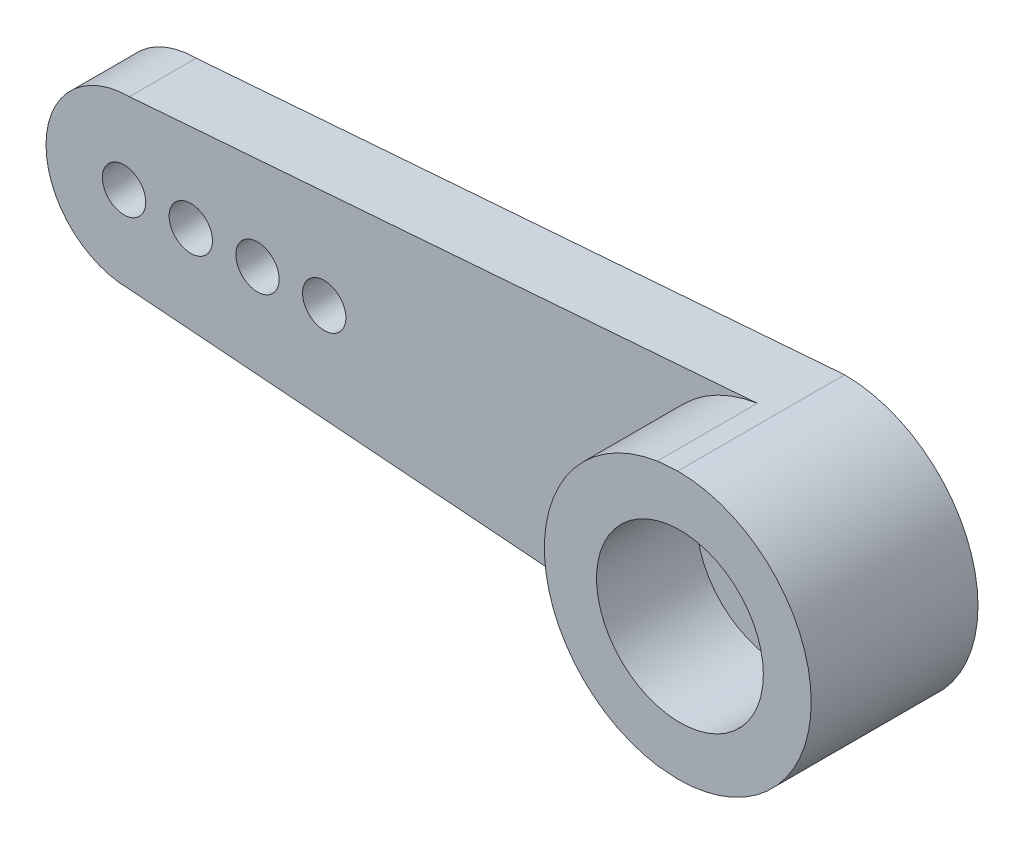
ISO-10303-21;
HEADER;
FILE_DESCRIPTION(('STEP AP214'),'2;1');
FILE_NAME('part.step','',(''),(''),'','','');
FILE_SCHEMA(('AUTOMOTIVE_DESIGN { 1 0 10303 214 1 1 1 1 }'));
ENDSEC;
DATA;
#1=APPLICATION_CONTEXT('core data for automotive mechanical design processes');
#2=APPLICATION_PROTOCOL_DEFINITION('international standard','automotive_design',2000,#1);
#3=PRODUCT_CONTEXT('',#1,'mechanical');
#4=PRODUCT('Part','Part','',(#3));
#5=PRODUCT_RELATED_PRODUCT_CATEGORY('part','',(#4));
#6=PRODUCT_DEFINITION_FORMATION('','',#4);
#7=PRODUCT_DEFINITION_CONTEXT('part definition',#1,'design');
#8=PRODUCT_DEFINITION('design','',#6,#7);
#9=PRODUCT_DEFINITION_SHAPE('','',#8);
#10=(LENGTH_UNIT() NAMED_UNIT(*) SI_UNIT(.MILLI.,.METRE.));
#11=(NAMED_UNIT(*) PLANE_ANGLE_UNIT() SI_UNIT($,.RADIAN.));
#12=(NAMED_UNIT(*) SI_UNIT($,.STERADIAN.) SOLID_ANGLE_UNIT());
#13=UNCERTAINTY_MEASURE_WITH_UNIT(LENGTH_MEASURE(1.E-05),#10,'distance_accuracy_value','');
#14=(GEOMETRIC_REPRESENTATION_CONTEXT(3) GLOBAL_UNCERTAINTY_ASSIGNED_CONTEXT((#13)) GLOBAL_UNIT_ASSIGNED_CONTEXT((#10,
#11,#12)) REPRESENTATION_CONTEXT('',''));
#15=CARTESIAN_POINT('',(0.,0.,0.));
#16=DIRECTION('',(0.,0.,1.));
#17=DIRECTION('',(1.,0.,0.));
#18=AXIS2_PLACEMENT_3D('',#15,#16,#17);
#19=CARTESIAN_POINT('',(-47.290124109333,0.,2.4));
#20=DIRECTION('',(0.,0.,-1.));
#21=DIRECTION('',(-1.,0.,0.));
#22=AXIS2_PLACEMENT_3D('',#19,#20,#21);
#23=CYLINDRICAL_SURFACE('',#22,3.);
#24=CARTESIAN_POINT('',(-47.290124109333,0.,0.));
#25=DIRECTION('',(0.,0.,1.));
#26=DIRECTION('',(1.,0.,0.));
#27=AXIS2_PLACEMENT_3D('',#24,#25,#26);
#28=CIRCLE('',#27,3.);
#29=CARTESIAN_POINT('',(-47.290124109333,3.,0.));
#30=VERTEX_POINT('',#29);
#31=CARTESIAN_POINT('',(-47.290124109333,-3.,0.));
#32=VERTEX_POINT('',#31);
#33=EDGE_CURVE('E124',#30,#32,#28,.T.);
#34=ORIENTED_EDGE('',*,*,#33,.T.);
#35=DIRECTION('',(0.,0.,-1.));
#36=VECTOR('',#35,1.);
#37=CARTESIAN_POINT('',(-47.290124109333,-3.,2.4));
#38=LINE('',#37,#36);
#39=CARTESIAN_POINT('',(-47.290124109333,-3.,2.4));
#40=VERTEX_POINT('',#39);
#41=EDGE_CURVE('E11',#40,#32,#38,.T.);
#42=ORIENTED_EDGE('',*,*,#41,.F.);
#43=CARTESIAN_POINT('',(-47.290124109333,0.,2.4));
#44=DIRECTION('',(0.,0.,1.));
#45=DIRECTION('',(1.,0.,0.));
#46=AXIS2_PLACEMENT_3D('',#43,#44,#45);
#47=CIRCLE('',#46,3.);
#48=CARTESIAN_POINT('',(-47.290124109333,3.,2.4));
#49=VERTEX_POINT('',#48);
#50=EDGE_CURVE('E135',#49,#40,#47,.T.);
#51=ORIENTED_EDGE('',*,*,#50,.F.);
#52=DIRECTION('',(0.,0.,-1.));
#53=VECTOR('',#52,1.);
#54=CARTESIAN_POINT('',(-47.290124109333,3.,2.4));
#55=LINE('',#54,#53);
#56=EDGE_CURVE('E52',#49,#30,#55,.T.);
#57=ORIENTED_EDGE('',*,*,#56,.T.);
#58=EDGE_LOOP('',(#34,#42,#51,#57));
#59=FACE_BOUND('',#58,.T.);
#60=ADVANCED_FACE('F42',(#59),#23,.T.);
#61=CARTESIAN_POINT('',(-0.50999827244376,-6.6095776108711,2.4));
#62=DIRECTION('',(0.0769318176024456,0.997036356127691,0.));
#63=DIRECTION('',(-0.997036356127691,0.0769318176024456,0.));
#64=AXIS2_PLACEMENT_3D('',#61,#62,#63);
#65=PLANE('',#64);
#66=DIRECTION('',(0.997036356127691,-0.0769318176024456,0.));
#67=VECTOR('',#66,1.);
#68=CARTESIAN_POINT('',(-0.50999827244376,-6.6095776108711,0.));
#69=LINE('',#68,#67);
#70=CARTESIAN_POINT('',(-23.962124109333,-4.80000000000001,0.));
#71=VERTEX_POINT('',#70);
#72=EDGE_CURVE('E71',#32,#71,#69,.T.);
#73=ORIENTED_EDGE('',*,*,#72,.T.);
#74=DIRECTION('',(0.,0.,-1.));
#75=VECTOR('',#74,1.);
#76=CARTESIAN_POINT('',(-23.962124109333,-4.80000000000001,6.));
#77=LINE('',#76,#75);
#78=CARTESIAN_POINT('',(-23.962124109333,-4.80000000000001,6.));
#79=VERTEX_POINT('',#78);
#80=EDGE_CURVE('E107',#79,#71,#77,.T.);
#81=ORIENTED_EDGE('',*,*,#80,.F.);
#82=DIRECTION('',(0.997036356127691,-0.0769318176024456,0.));
#83=VECTOR('',#82,1.);
#84=CARTESIAN_POINT('',(-0.50999827244376,-6.6095776108711,6.));
#85=LINE('',#84,#83);
#86=CARTESIAN_POINT('',(-24.6984807726222,-4.74318235622769,6.));
#87=VERTEX_POINT('',#86);
#88=EDGE_CURVE('E100',#87,#79,#85,.T.);
#89=ORIENTED_EDGE('',*,*,#88,.F.);
#90=DIRECTION('',(0.,0.,-1.));
#91=VECTOR('',#90,1.);
#92=CARTESIAN_POINT('',(-24.6984807726222,-4.74318235622769,6.));
#93=LINE('',#92,#91);
#94=CARTESIAN_POINT('',(-24.6984807726222,-4.74318235622769,2.4));
#95=VERTEX_POINT('',#94);
#96=EDGE_CURVE('E104',#87,#95,#93,.T.);
#97=ORIENTED_EDGE('',*,*,#96,.T.);
#98=DIRECTION('',(0.997036356127691,-0.0769318176024456,0.));
#99=VECTOR('',#98,1.);
#100=CARTESIAN_POINT('',(-0.50999827244376,-6.6095776108711,2.4));
#101=LINE('',#100,#99);
#102=EDGE_CURVE('E139',#40,#95,#101,.T.);
#103=ORIENTED_EDGE('',*,*,#102,.F.);
#104=ORIENTED_EDGE('',*,*,#41,.T.);
#105=EDGE_LOOP('',(#73,#81,#89,#97,#103,#104));
#106=FACE_BOUND('',#105,.T.);
#107=ADVANCED_FACE('F102',(#106),#65,.F.);
#108=CARTESIAN_POINT('',(-0.50999827244376,6.6095776108711,2.4));
#109=DIRECTION('',(-0.0769318176024456,0.997036356127691,0.));
#110=DIRECTION('',(-0.997036356127691,-0.0769318176024456,0.));
#111=AXIS2_PLACEMENT_3D('',#108,#109,#110);
#112=PLANE('',#111);
#113=DIRECTION('',(0.997036356127691,0.0769318176024456,0.));
#114=VECTOR('',#113,1.);
#115=CARTESIAN_POINT('',(-0.50999827244376,6.6095776108711,0.));
#116=LINE('',#115,#114);
#117=CARTESIAN_POINT('',(-23.962124109333,4.80000000000001,0.));
#118=VERTEX_POINT('',#117);
#119=EDGE_CURVE('E140',#30,#118,#116,.T.);
#120=ORIENTED_EDGE('',*,*,#119,.F.);
#121=ORIENTED_EDGE('',*,*,#56,.F.);
#122=DIRECTION('',(0.997036356127691,0.0769318176024456,0.));
#123=VECTOR('',#122,1.);
#124=CARTESIAN_POINT('',(-0.50999827244376,6.6095776108711,2.4));
#125=LINE('',#124,#123);
#126=CARTESIAN_POINT('',(-24.698480772622,4.74318235622771,2.4));
#127=VERTEX_POINT('',#126);
#128=EDGE_CURVE('E145',#49,#127,#125,.T.);
#129=ORIENTED_EDGE('',*,*,#128,.T.);
#130=DIRECTION('',(0.,0.,-1.));
#131=VECTOR('',#130,1.);
#132=CARTESIAN_POINT('',(-24.698480772622,4.74318235622771,6.));
#133=LINE('',#132,#131);
#134=CARTESIAN_POINT('',(-24.698480772622,4.74318235622771,6.));
#135=VERTEX_POINT('',#134);
#136=EDGE_CURVE('E78',#135,#127,#133,.T.);
#137=ORIENTED_EDGE('',*,*,#136,.F.);
#138=DIRECTION('',(0.997036356127691,0.0769318176024456,0.));
#139=VECTOR('',#138,1.);
#140=CARTESIAN_POINT('',(-0.50999827244376,6.6095776108711,6.));
#141=LINE('',#140,#139);
#142=CARTESIAN_POINT('',(-23.962124109333,4.80000000000001,6.));
#143=VERTEX_POINT('',#142);
#144=EDGE_CURVE('E117',#135,#143,#141,.T.);
#145=ORIENTED_EDGE('',*,*,#144,.T.);
#146=DIRECTION('',(0.,0.,-1.));
#147=VECTOR('',#146,1.);
#148=CARTESIAN_POINT('',(-23.962124109333,4.80000000000001,6.));
#149=LINE('',#148,#147);
#150=EDGE_CURVE('E131',#143,#118,#149,.T.);
#151=ORIENTED_EDGE('',*,*,#150,.T.);
#152=EDGE_LOOP('',(#120,#121,#129,#137,#145,#151));
#153=FACE_BOUND('',#152,.T.);
#154=ADVANCED_FACE('F159',(#153),#112,.T.);
#155=CARTESIAN_POINT('',(0.,0.,2.4));
#156=DIRECTION('',(0.,0.,1.));
#157=DIRECTION('',(1.,0.,0.));
#158=AXIS2_PLACEMENT_3D('',#155,#156,#157);
#159=PLANE('',#158);
#160=CARTESIAN_POINT('',(-47.4814019612746,0.,2.4));
#161=DIRECTION('',(0.,0.,1.));
#162=DIRECTION('',(1.,0.,0.));
#163=AXIS2_PLACEMENT_3D('',#160,#161,#162);
#164=CIRCLE('',#163,0.780000000000002);
#165=CARTESIAN_POINT('',(-46.7014019612746,0.,2.4));
#166=VERTEX_POINT('',#165);
#167=EDGE_CURVE('E171',#166,#166,#164,.T.);
#168=ORIENTED_EDGE('',*,*,#167,.F.);
#169=EDGE_LOOP('',(#168));
#170=FACE_BOUND('',#169,.T.);
#171=CARTESIAN_POINT('',(-45.0814019612746,0.,2.4));
#172=DIRECTION('',(0.,0.,1.));
#173=DIRECTION('',(1.,0.,0.));
#174=AXIS2_PLACEMENT_3D('',#171,#172,#173);
#175=CIRCLE('',#174,0.780000000000002);
#176=CARTESIAN_POINT('',(-44.3014019612746,0.,2.4));
#177=VERTEX_POINT('',#176);
#178=EDGE_CURVE('E199',#177,#177,#175,.T.);
#179=ORIENTED_EDGE('',*,*,#178,.F.);
#180=EDGE_LOOP('',(#179));
#181=FACE_BOUND('',#180,.T.);
#182=CARTESIAN_POINT('',(-42.6814019612746,0.,2.4));
#183=DIRECTION('',(0.,0.,1.));
#184=DIRECTION('',(1.,0.,0.));
#185=AXIS2_PLACEMENT_3D('',#182,#183,#184);
#186=CIRCLE('',#185,0.780000000000002);
#187=CARTESIAN_POINT('',(-41.9014019612746,0.,2.4));
#188=VERTEX_POINT('',#187);
#189=EDGE_CURVE('E191',#188,#188,#186,.T.);
#190=ORIENTED_EDGE('',*,*,#189,.F.);
#191=EDGE_LOOP('',(#190));
#192=FACE_BOUND('',#191,.T.);
#193=CARTESIAN_POINT('',(-40.2814019612746,0.,2.4));
#194=DIRECTION('',(0.,0.,1.));
#195=DIRECTION('',(1.,0.,0.));
#196=AXIS2_PLACEMENT_3D('',#193,#194,#195);
#197=CIRCLE('',#196,0.780000000000002);
#198=CARTESIAN_POINT('',(-39.5014019612746,0.,2.4));
#199=VERTEX_POINT('',#198);
#200=EDGE_CURVE('E182',#199,#199,#197,.T.);
#201=ORIENTED_EDGE('',*,*,#200,.F.);
#202=EDGE_LOOP('',(#201));
#203=FACE_BOUND('',#202,.T.);
#204=ORIENTED_EDGE('',*,*,#50,.T.);
#205=ORIENTED_EDGE('',*,*,#102,.T.);
#206=CARTESIAN_POINT('',(-23.962124109333,0.,2.4));
#207=DIRECTION('',(0.,0.,1.));
#208=DIRECTION('',(1.,0.,0.));
#209=AXIS2_PLACEMENT_3D('',#206,#207,#208);
#210=CIRCLE('',#209,4.8);
#211=EDGE_CURVE('E122',#127,#95,#210,.T.);
#212=ORIENTED_EDGE('',*,*,#211,.F.);
#213=ORIENTED_EDGE('',*,*,#128,.F.);
#214=EDGE_LOOP('',(#204,#205,#212,#213));
#215=FACE_BOUND('',#214,.T.);
#216=ADVANCED_FACE('F254',(#170,#181,#192,#203,#215),#159,.T.);
#217=CARTESIAN_POINT('',(0.,0.,0.));
#218=DIRECTION('',(0.,0.,1.));
#219=DIRECTION('',(1.,0.,0.));
#220=AXIS2_PLACEMENT_3D('',#217,#218,#219);
#221=PLANE('',#220);
#222=CARTESIAN_POINT('',(-23.962124109333,0.,0.));
#223=DIRECTION('',(0.,0.,-1.));
#224=DIRECTION('',(-1.,0.,0.));
#225=AXIS2_PLACEMENT_3D('',#222,#223,#224);
#226=CIRCLE('',#225,3.6);
#227=CARTESIAN_POINT('',(-27.562124109333,0.,0.));
#228=VERTEX_POINT('',#227);
#229=EDGE_CURVE('E210',#228,#228,#226,.T.);
#230=ORIENTED_EDGE('',*,*,#229,.F.);
#231=EDGE_LOOP('',(#230));
#232=FACE_BOUND('',#231,.T.);
#233=CARTESIAN_POINT('',(-47.4814019612746,0.,0.));
#234=DIRECTION('',(0.,0.,1.));
#235=DIRECTION('',(1.,0.,0.));
#236=AXIS2_PLACEMENT_3D('',#233,#234,#235);
#237=CIRCLE('',#236,0.780000000000002);
#238=CARTESIAN_POINT('',(-46.7014019612746,0.,0.));
#239=VERTEX_POINT('',#238);
#240=EDGE_CURVE('E166',#239,#239,#237,.T.);
#241=ORIENTED_EDGE('',*,*,#240,.T.);
#242=EDGE_LOOP('',(#241));
#243=FACE_BOUND('',#242,.T.);
#244=CARTESIAN_POINT('',(-45.0814019612746,0.,0.));
#245=DIRECTION('',(0.,0.,1.));
#246=DIRECTION('',(1.,0.,0.));
#247=AXIS2_PLACEMENT_3D('',#244,#245,#246);
#248=CIRCLE('',#247,0.780000000000002);
#249=CARTESIAN_POINT('',(-44.3014019612746,0.,0.));
#250=VERTEX_POINT('',#249);
#251=EDGE_CURVE('E203',#250,#250,#248,.T.);
#252=ORIENTED_EDGE('',*,*,#251,.T.);
#253=EDGE_LOOP('',(#252));
#254=FACE_BOUND('',#253,.T.);
#255=CARTESIAN_POINT('',(-42.6814019612746,0.,0.));
#256=DIRECTION('',(0.,0.,1.));
#257=DIRECTION('',(1.,0.,0.));
#258=AXIS2_PLACEMENT_3D('',#255,#256,#257);
#259=CIRCLE('',#258,0.780000000000002);
#260=CARTESIAN_POINT('',(-41.9014019612746,0.,0.));
#261=VERTEX_POINT('',#260);
#262=EDGE_CURVE('E195',#261,#261,#259,.T.);
#263=ORIENTED_EDGE('',*,*,#262,.T.);
#264=EDGE_LOOP('',(#263));
#265=FACE_BOUND('',#264,.T.);
#266=CARTESIAN_POINT('',(-40.2814019612746,0.,0.));
#267=DIRECTION('',(0.,0.,1.));
#268=DIRECTION('',(1.,0.,0.));
#269=AXIS2_PLACEMENT_3D('',#266,#267,#268);
#270=CIRCLE('',#269,0.780000000000002);
#271=CARTESIAN_POINT('',(-39.5014019612746,0.,0.));
#272=VERTEX_POINT('',#271);
#273=EDGE_CURVE('E186',#272,#272,#270,.T.);
#274=ORIENTED_EDGE('',*,*,#273,.T.);
#275=EDGE_LOOP('',(#274));
#276=FACE_BOUND('',#275,.T.);
#277=ORIENTED_EDGE('',*,*,#33,.F.);
#278=ORIENTED_EDGE('',*,*,#119,.T.);
#279=CARTESIAN_POINT('',(-23.962124109333,0.,0.));
#280=DIRECTION('',(0.,0.,1.));
#281=DIRECTION('',(1.,0.,0.));
#282=AXIS2_PLACEMENT_3D('',#279,#280,#281);
#283=CIRCLE('',#282,4.8);
#284=EDGE_CURVE('E119',#71,#118,#283,.T.);
#285=ORIENTED_EDGE('',*,*,#284,.F.);
#286=ORIENTED_EDGE('',*,*,#72,.F.);
#287=EDGE_LOOP('',(#277,#278,#285,#286));
#288=FACE_BOUND('',#287,.T.);
#289=ADVANCED_FACE('F157',(#232,#243,#254,#265,#276,#288),#221,.F.);
#290=CARTESIAN_POINT('',(-23.962124109333,0.,6.));
#291=DIRECTION('',(0.,0.,-1.));
#292=DIRECTION('',(-1.,0.,0.));
#293=AXIS2_PLACEMENT_3D('',#290,#291,#292);
#294=CYLINDRICAL_SURFACE('',#293,4.8);
#295=ORIENTED_EDGE('',*,*,#211,.T.);
#296=ORIENTED_EDGE('',*,*,#96,.F.);
#297=CARTESIAN_POINT('',(-23.962124109333,0.,6.));
#298=DIRECTION('',(0.,0.,1.));
#299=DIRECTION('',(1.,0.,0.));
#300=AXIS2_PLACEMENT_3D('',#297,#298,#299);
#301=CIRCLE('',#300,4.8);
#302=EDGE_CURVE('E112',#135,#87,#301,.T.);
#303=ORIENTED_EDGE('',*,*,#302,.F.);
#304=ORIENTED_EDGE('',*,*,#136,.T.);
#305=EDGE_LOOP('',(#295,#296,#303,#304));
#306=FACE_BOUND('',#305,.T.);
#307=ADVANCED_FACE('F121',(#306),#294,.T.);
#308=ORIENTED_EDGE('',*,*,#284,.T.);
#309=ORIENTED_EDGE('',*,*,#150,.F.);
#310=EDGE_CURVE('E111',#79,#143,#301,.T.);
#311=ORIENTED_EDGE('',*,*,#310,.F.);
#312=ORIENTED_EDGE('',*,*,#80,.T.);
#313=EDGE_LOOP('',(#308,#309,#311,#312));
#314=FACE_BOUND('',#313,.T.);
#315=ADVANCED_FACE('F164',(#314),#294,.T.);
#316=CARTESIAN_POINT('',(0.,0.,6.));
#317=DIRECTION('',(0.,0.,1.));
#318=DIRECTION('',(1.,0.,0.));
#319=AXIS2_PLACEMENT_3D('',#316,#317,#318);
#320=PLANE('',#319);
#321=CARTESIAN_POINT('',(-23.8841379351826,0.,6.));
#322=DIRECTION('',(0.,0.,1.));
#323=DIRECTION('',(1.,0.,0.));
#324=AXIS2_PLACEMENT_3D('',#321,#322,#323);
#325=CIRCLE('',#324,3.);
#326=CARTESIAN_POINT('',(-20.8841379351826,0.,6.));
#327=VERTEX_POINT('',#326);
#328=EDGE_CURVE('E218',#327,#327,#325,.T.);
#329=ORIENTED_EDGE('',*,*,#328,.F.);
#330=EDGE_LOOP('',(#329));
#331=FACE_BOUND('',#330,.T.);
#332=ORIENTED_EDGE('',*,*,#302,.T.);
#333=ORIENTED_EDGE('',*,*,#88,.T.);
#334=ORIENTED_EDGE('',*,*,#310,.T.);
#335=ORIENTED_EDGE('',*,*,#144,.F.);
#336=EDGE_LOOP('',(#332,#333,#334,#335));
#337=FACE_BOUND('',#336,.T.);
#338=ADVANCED_FACE('F115',(#331,#337),#320,.T.);
#339=CARTESIAN_POINT('',(-40.2814019612746,0.,0.));
#340=DIRECTION('',(0.,0.,1.));
#341=DIRECTION('',(1.,0.,0.));
#342=AXIS2_PLACEMENT_3D('',#339,#340,#341);
#343=CYLINDRICAL_SURFACE('',#342,0.780000000000002);
#344=ORIENTED_EDGE('',*,*,#273,.F.);
#345=EDGE_LOOP('',(#344));
#346=FACE_BOUND('',#345,.T.);
#347=ORIENTED_EDGE('',*,*,#200,.T.);
#348=EDGE_LOOP('',(#347));
#349=FACE_BOUND('',#348,.T.);
#350=ADVANCED_FACE('F264',(#346,#349),#343,.F.);
#351=CARTESIAN_POINT('',(-42.6814019612746,0.,0.));
#352=DIRECTION('',(0.,0.,1.));
#353=DIRECTION('',(1.,0.,0.));
#354=AXIS2_PLACEMENT_3D('',#351,#352,#353);
#355=CYLINDRICAL_SURFACE('',#354,0.780000000000002);
#356=ORIENTED_EDGE('',*,*,#262,.F.);
#357=EDGE_LOOP('',(#356));
#358=FACE_BOUND('',#357,.T.);
#359=ORIENTED_EDGE('',*,*,#189,.T.);
#360=EDGE_LOOP('',(#359));
#361=FACE_BOUND('',#360,.T.);
#362=ADVANCED_FACE('F267',(#358,#361),#355,.F.);
#363=CARTESIAN_POINT('',(-45.0814019612746,0.,0.));
#364=DIRECTION('',(0.,0.,1.));
#365=DIRECTION('',(1.,0.,0.));
#366=AXIS2_PLACEMENT_3D('',#363,#364,#365);
#367=CYLINDRICAL_SURFACE('',#366,0.780000000000002);
#368=ORIENTED_EDGE('',*,*,#251,.F.);
#369=EDGE_LOOP('',(#368));
#370=FACE_BOUND('',#369,.T.);
#371=ORIENTED_EDGE('',*,*,#178,.T.);
#372=EDGE_LOOP('',(#371));
#373=FACE_BOUND('',#372,.T.);
#374=ADVANCED_FACE('F343',(#370,#373),#367,.F.);
#375=CARTESIAN_POINT('',(-47.4814019612746,0.,0.));
#376=DIRECTION('',(0.,0.,1.));
#377=DIRECTION('',(1.,0.,0.));
#378=AXIS2_PLACEMENT_3D('',#375,#376,#377);
#379=CYLINDRICAL_SURFACE('',#378,0.780000000000002);
#380=ORIENTED_EDGE('',*,*,#240,.F.);
#381=EDGE_LOOP('',(#380));
#382=FACE_BOUND('',#381,.T.);
#383=ORIENTED_EDGE('',*,*,#167,.T.);
#384=EDGE_LOOP('',(#383));
#385=FACE_BOUND('',#384,.T.);
#386=ADVANCED_FACE('F248',(#382,#385),#379,.F.);
#387=CARTESIAN_POINT('',(-23.962124109333,0.,0.6));
#388=DIRECTION('',(0.,0.,-1.));
#389=DIRECTION('',(-1.,0.,0.));
#390=AXIS2_PLACEMENT_3D('',#387,#388,#389);
#391=CYLINDRICAL_SURFACE('',#390,3.6);
#392=CARTESIAN_POINT('',(-23.962124109333,0.,0.6));
#393=DIRECTION('',(0.,0.,-1.));
#394=DIRECTION('',(-1.,0.,0.));
#395=AXIS2_PLACEMENT_3D('',#392,#393,#394);
#396=CIRCLE('',#395,3.6);
#397=CARTESIAN_POINT('',(-27.562124109333,0.,0.6));
#398=VERTEX_POINT('',#397);
#399=EDGE_CURVE('E187',#398,#398,#396,.T.);
#400=ORIENTED_EDGE('',*,*,#399,.F.);
#401=EDGE_LOOP('',(#400));
#402=FACE_BOUND('',#401,.T.);
#403=ORIENTED_EDGE('',*,*,#229,.T.);
#404=EDGE_LOOP('',(#403));
#405=FACE_BOUND('',#404,.T.);
#406=ADVANCED_FACE('F242',(#402,#405),#391,.F.);
#407=CARTESIAN_POINT('',(-23.962124109333,0.,0.6));
#408=DIRECTION('',(0.,0.,-1.));
#409=DIRECTION('',(-1.,0.,0.));
#410=AXIS2_PLACEMENT_3D('',#407,#408,#409);
#411=PLANE('',#410);
#412=CARTESIAN_POINT('',(-23.8841379351826,0.,0.6));
#413=DIRECTION('',(0.,0.,-1.));
#414=DIRECTION('',(-1.,0.,0.));
#415=AXIS2_PLACEMENT_3D('',#412,#413,#414);
#416=CIRCLE('',#415,1.2);
#417=CARTESIAN_POINT('',(-25.0841379351826,0.,0.6));
#418=VERTEX_POINT('',#417);
#419=EDGE_CURVE('E45',#418,#418,#416,.T.);
#420=ORIENTED_EDGE('',*,*,#419,.F.);
#421=EDGE_LOOP('',(#420));
#422=FACE_BOUND('',#421,.T.);
#423=ORIENTED_EDGE('',*,*,#399,.T.);
#424=EDGE_LOOP('',(#423));
#425=FACE_BOUND('',#424,.T.);
#426=ADVANCED_FACE('F238',(#422,#425),#411,.T.);
#427=CARTESIAN_POINT('',(-23.8841379351826,0.,2.4));
#428=DIRECTION('',(0.,0.,1.));
#429=DIRECTION('',(1.,0.,0.));
#430=AXIS2_PLACEMENT_3D('',#427,#428,#429);
#431=CYLINDRICAL_SURFACE('',#430,3.);
#432=CARTESIAN_POINT('',(-23.8841379351826,0.,2.4));
#433=DIRECTION('',(0.,0.,1.));
#434=DIRECTION('',(1.,0.,0.));
#435=AXIS2_PLACEMENT_3D('',#432,#433,#434);
#436=CIRCLE('',#435,3.);
#437=CARTESIAN_POINT('',(-20.8841379351826,0.,2.4));
#438=VERTEX_POINT('',#437);
#439=EDGE_CURVE('E214',#438,#438,#436,.T.);
#440=ORIENTED_EDGE('',*,*,#439,.F.);
#441=EDGE_LOOP('',(#440));
#442=FACE_BOUND('',#441,.T.);
#443=ORIENTED_EDGE('',*,*,#328,.T.);
#444=EDGE_LOOP('',(#443));
#445=FACE_BOUND('',#444,.T.);
#446=ADVANCED_FACE('F241',(#442,#445),#431,.F.);
#447=CARTESIAN_POINT('',(-23.8841379351826,0.,2.4));
#448=DIRECTION('',(0.,0.,1.));
#449=DIRECTION('',(1.,0.,0.));
#450=AXIS2_PLACEMENT_3D('',#447,#448,#449);
#451=PLANE('',#450);
#452=CARTESIAN_POINT('',(-23.8841379351826,0.,2.4));
#453=DIRECTION('',(0.,0.,1.));
#454=DIRECTION('',(1.,0.,0.));
#455=AXIS2_PLACEMENT_3D('',#452,#453,#454);
#456=CIRCLE('',#455,1.2);
#457=CARTESIAN_POINT('',(-22.6841379351826,0.,2.4));
#458=VERTEX_POINT('',#457);
#459=EDGE_CURVE('E225',#458,#458,#456,.T.);
#460=ORIENTED_EDGE('',*,*,#459,.F.);
#461=EDGE_LOOP('',(#460));
#462=FACE_BOUND('',#461,.T.);
#463=ORIENTED_EDGE('',*,*,#439,.T.);
#464=EDGE_LOOP('',(#463));
#465=FACE_BOUND('',#464,.T.);
#466=ADVANCED_FACE('F381',(#462,#465),#451,.T.);
#467=CARTESIAN_POINT('',(-23.8841379351826,0.,-1.2));
#468=DIRECTION('',(0.,0.,1.));
#469=DIRECTION('',(1.,0.,0.));
#470=AXIS2_PLACEMENT_3D('',#467,#468,#469);
#471=CYLINDRICAL_SURFACE('',#470,1.2);
#472=ORIENTED_EDGE('',*,*,#419,.T.);
#473=EDGE_LOOP('',(#472));
#474=FACE_BOUND('',#473,.T.);
#475=ORIENTED_EDGE('',*,*,#459,.T.);
#476=EDGE_LOOP('',(#475));
#477=FACE_BOUND('',#476,.T.);
#478=ADVANCED_FACE('F236',(#474,#477),#471,.F.);
#479=CLOSED_SHELL('',(#60,#107,#154,#216,#289,#307,#315,#338,#350,#362,#374,#386,#406,#426,#446,
#466,#478));
#480=MANIFOLD_SOLID_BREP('B2',#479);
#481=ADVANCED_BREP_SHAPE_REPRESENTATION('',(#18,#480),#14);
#482=SHAPE_DEFINITION_REPRESENTATION(#9,#481);
ENDSEC;
END-ISO-10303-21;
